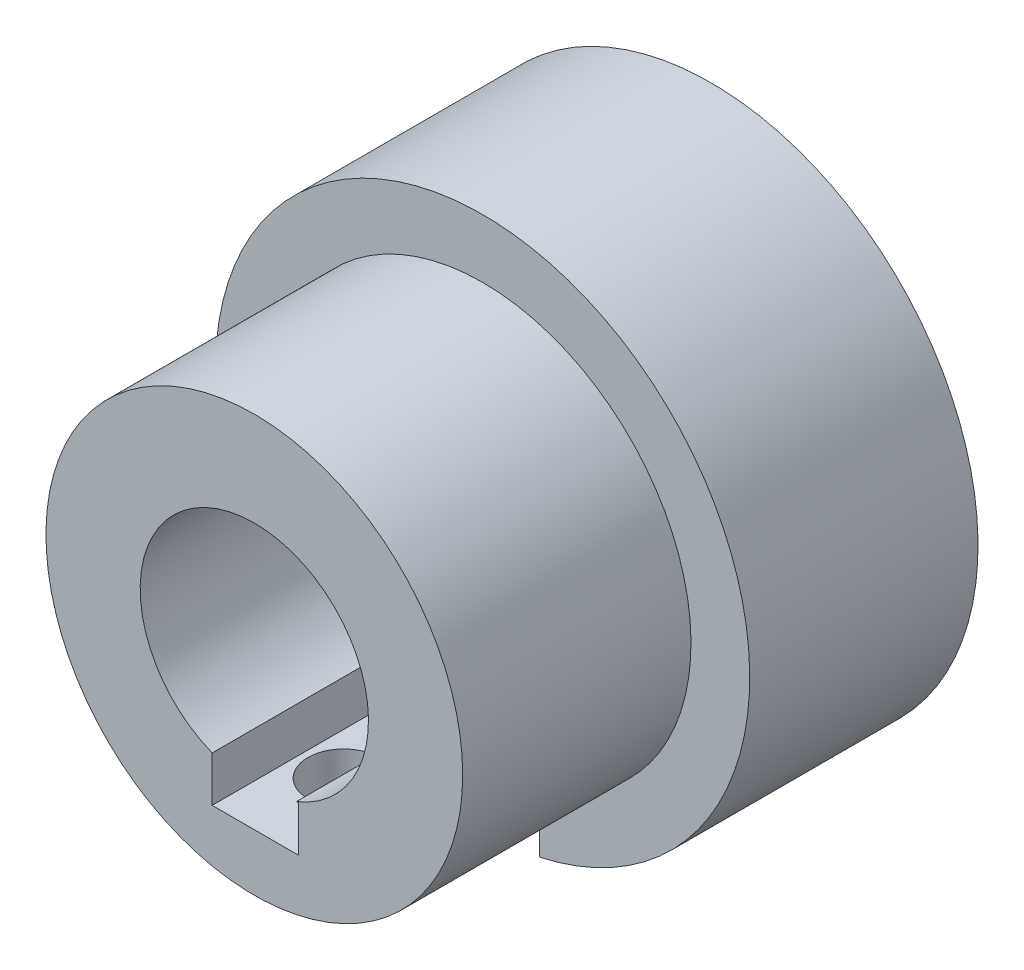
ISO-10303-21;
HEADER;
FILE_DESCRIPTION(('STEP AP214'),'2;1');
FILE_NAME('part.step','',(''),(''),'','','');
FILE_SCHEMA(('AUTOMOTIVE_DESIGN { 1 0 10303 214 1 1 1 1 }'));
ENDSEC;
DATA;
#1=APPLICATION_CONTEXT('core data for automotive mechanical design processes');
#2=APPLICATION_PROTOCOL_DEFINITION('international standard','automotive_design',2000,#1);
#3=PRODUCT_CONTEXT('',#1,'mechanical');
#4=PRODUCT('Part','Part','',(#3));
#5=PRODUCT_RELATED_PRODUCT_CATEGORY('part','',(#4));
#6=PRODUCT_DEFINITION_FORMATION('','',#4);
#7=PRODUCT_DEFINITION_CONTEXT('part definition',#1,'design');
#8=PRODUCT_DEFINITION('design','',#6,#7);
#9=PRODUCT_DEFINITION_SHAPE('','',#8);
#10=(LENGTH_UNIT() NAMED_UNIT(*) SI_UNIT(.MILLI.,.METRE.));
#11=(NAMED_UNIT(*) PLANE_ANGLE_UNIT() SI_UNIT($,.RADIAN.));
#12=(NAMED_UNIT(*) SI_UNIT($,.STERADIAN.) SOLID_ANGLE_UNIT());
#13=UNCERTAINTY_MEASURE_WITH_UNIT(LENGTH_MEASURE(1.E-05),#10,'distance_accuracy_value','');
#14=(GEOMETRIC_REPRESENTATION_CONTEXT(3) GLOBAL_UNCERTAINTY_ASSIGNED_CONTEXT((#13)) GLOBAL_UNIT_ASSIGNED_CONTEXT((#10,
#11,#12)) REPRESENTATION_CONTEXT('',''));
#15=CARTESIAN_POINT('',(0.,0.,0.));
#16=DIRECTION('',(0.,0.,1.));
#17=DIRECTION('',(1.,0.,0.));
#18=AXIS2_PLACEMENT_3D('',#15,#16,#17);
#19=CARTESIAN_POINT('',(5.,0.,20.));
#20=DIRECTION('',(1.,0.,0.));
#21=DIRECTION('',(0.,1.,0.));
#22=AXIS2_PLACEMENT_3D('',#19,#20,#21);
#23=PLANE('',#22);
#24=DIRECTION('',(0.,-1.,0.));
#25=VECTOR('',#24,1.);
#26=CARTESIAN_POINT('',(5.,0.,0.));
#27=LINE('',#26,#25);
#28=CARTESIAN_POINT('',(5.,-3.5142103749595,0.));
#29=VERTEX_POINT('',#28);
#30=CARTESIAN_POINT('',(5.,-22.8595712995673,0.));
#31=VERTEX_POINT('',#30);
#32=EDGE_CURVE('E170',#29,#31,#27,.T.);
#33=ORIENTED_EDGE('',*,*,#32,.T.);
#34=DIRECTION('',(0.,0.,-1.));
#35=VECTOR('',#34,1.);
#36=CARTESIAN_POINT('',(5.,-22.8595712995673,20.));
#37=LINE('',#36,#35);
#38=CARTESIAN_POINT('',(5.,-22.8595712995673,20.));
#39=VERTEX_POINT('',#38);
#40=EDGE_CURVE('E42',#39,#31,#37,.T.);
#41=ORIENTED_EDGE('',*,*,#40,.F.);
#42=DIRECTION('',(0.,-1.,0.));
#43=VECTOR('',#42,1.);
#44=CARTESIAN_POINT('',(5.,0.,20.));
#45=LINE('',#44,#43);
#46=CARTESIAN_POINT('',(5.,-17.5553082315678,20.));
#47=VERTEX_POINT('',#46);
#48=EDGE_CURVE('E177',#47,#39,#45,.T.);
#49=ORIENTED_EDGE('',*,*,#48,.F.);
#50=CARTESIAN_POINT('',(5.,-8.66025403784439,20.));
#51=VERTEX_POINT('',#50);
#52=EDGE_CURVE('E176',#51,#47,#45,.T.);
#53=ORIENTED_EDGE('',*,*,#52,.F.);
#54=CARTESIAN_POINT('',(5.,-3.5142103749595,20.));
#55=VERTEX_POINT('',#54);
#56=EDGE_CURVE('E173',#55,#51,#45,.T.);
#57=ORIENTED_EDGE('',*,*,#56,.F.);
#58=DIRECTION('',(0.,0.,-1.));
#59=VECTOR('',#58,1.);
#60=CARTESIAN_POINT('',(5.,-3.5142103749595,20.));
#61=LINE('',#60,#59);
#62=EDGE_CURVE('E187',#55,#29,#61,.T.);
#63=ORIENTED_EDGE('',*,*,#62,.T.);
#64=EDGE_LOOP('',(#33,#41,#49,#53,#57,#63));
#65=FACE_BOUND('',#64,.T.);
#66=ADVANCED_FACE('F34',(#65),#23,.F.);
#67=CARTESIAN_POINT('',(0.,0.,20.));
#68=DIRECTION('',(0.,0.,-1.));
#69=DIRECTION('',(-1.,0.,0.));
#70=AXIS2_PLACEMENT_3D('',#67,#68,#69);
#71=CYLINDRICAL_SURFACE('',#70,23.4);
#72=CARTESIAN_POINT('',(0.,0.,0.));
#73=DIRECTION('',(0.,0.,1.));
#74=DIRECTION('',(1.,0.,0.));
#75=AXIS2_PLACEMENT_3D('',#72,#73,#74);
#76=CIRCLE('',#75,23.4);
#77=CARTESIAN_POINT('',(-5.,-22.8595712995673,0.));
#78=VERTEX_POINT('',#77);
#79=EDGE_CURVE('E190',#31,#78,#76,.T.);
#80=ORIENTED_EDGE('',*,*,#79,.T.);
#81=DIRECTION('',(0.,0.,-1.));
#82=VECTOR('',#81,1.);
#83=CARTESIAN_POINT('',(-5.,-22.8595712995673,20.));
#84=LINE('',#83,#82);
#85=CARTESIAN_POINT('',(-5.,-22.8595712995673,20.));
#86=VERTEX_POINT('',#85);
#87=EDGE_CURVE('E202',#86,#78,#84,.T.);
#88=ORIENTED_EDGE('',*,*,#87,.F.);
#89=CARTESIAN_POINT('',(0.,0.,20.));
#90=DIRECTION('',(0.,0.,1.));
#91=DIRECTION('',(1.,0.,0.));
#92=AXIS2_PLACEMENT_3D('',#89,#90,#91);
#93=CIRCLE('',#92,23.4);
#94=EDGE_CURVE('E175',#39,#86,#93,.T.);
#95=ORIENTED_EDGE('',*,*,#94,.F.);
#96=ORIENTED_EDGE('',*,*,#40,.T.);
#97=EDGE_LOOP('',(#80,#88,#95,#96));
#98=FACE_BOUND('',#97,.T.);
#99=ADVANCED_FACE('F207',(#98),#71,.T.);
#100=CARTESIAN_POINT('',(-5.,0.,20.));
#101=DIRECTION('',(1.,0.,0.));
#102=DIRECTION('',(0.,1.,0.));
#103=AXIS2_PLACEMENT_3D('',#100,#101,#102);
#104=PLANE('',#103);
#105=DIRECTION('',(0.,-1.,0.));
#106=VECTOR('',#105,1.);
#107=CARTESIAN_POINT('',(-5.,0.,0.));
#108=LINE('',#107,#106);
#109=CARTESIAN_POINT('',(-5.,-3.5142103749595,0.));
#110=VERTEX_POINT('',#109);
#111=EDGE_CURVE('E193',#110,#78,#108,.T.);
#112=ORIENTED_EDGE('',*,*,#111,.F.);
#113=DIRECTION('',(0.,0.,-1.));
#114=VECTOR('',#113,1.);
#115=CARTESIAN_POINT('',(-5.,-3.5142103749595,20.));
#116=LINE('',#115,#114);
#117=CARTESIAN_POINT('',(-5.,-3.5142103749595,20.));
#118=VERTEX_POINT('',#117);
#119=EDGE_CURVE('E200',#118,#110,#116,.T.);
#120=ORIENTED_EDGE('',*,*,#119,.F.);
#121=DIRECTION('',(0.,-1.,0.));
#122=VECTOR('',#121,1.);
#123=CARTESIAN_POINT('',(-5.,0.,20.));
#124=LINE('',#123,#122);
#125=CARTESIAN_POINT('',(-5.,-8.66025403784439,20.));
#126=VERTEX_POINT('',#125);
#127=EDGE_CURVE('E181',#118,#126,#124,.T.);
#128=ORIENTED_EDGE('',*,*,#127,.T.);
#129=CARTESIAN_POINT('',(-5.,-17.5553082315678,20.));
#130=VERTEX_POINT('',#129);
#131=EDGE_CURVE('E185',#126,#130,#124,.T.);
#132=ORIENTED_EDGE('',*,*,#131,.T.);
#133=EDGE_CURVE('E180',#130,#86,#124,.T.);
#134=ORIENTED_EDGE('',*,*,#133,.T.);
#135=ORIENTED_EDGE('',*,*,#87,.T.);
#136=EDGE_LOOP('',(#112,#120,#128,#132,#134,#135));
#137=FACE_BOUND('',#136,.T.);
#138=ADVANCED_FACE('F220',(#137),#104,.T.);
#139=CARTESIAN_POINT('',(0.,-3.5142103749595,20.));
#140=DIRECTION('',(0.,1.,0.));
#141=DIRECTION('',(0.,0.,1.));
#142=AXIS2_PLACEMENT_3D('',#139,#140,#141);
#143=PLANE('',#142);
#144=DIRECTION('',(1.,0.,0.));
#145=VECTOR('',#144,1.);
#146=CARTESIAN_POINT('',(0.,-3.5142103749595,0.));
#147=LINE('',#146,#145);
#148=EDGE_CURVE('E196',#110,#29,#147,.T.);
#149=ORIENTED_EDGE('',*,*,#148,.T.);
#150=ORIENTED_EDGE('',*,*,#62,.F.);
#151=DIRECTION('',(1.,0.,0.));
#152=VECTOR('',#151,1.);
#153=CARTESIAN_POINT('',(0.,-3.5142103749595,20.));
#154=LINE('',#153,#152);
#155=EDGE_CURVE('E184',#118,#55,#154,.T.);
#156=ORIENTED_EDGE('',*,*,#155,.F.);
#157=ORIENTED_EDGE('',*,*,#119,.T.);
#158=EDGE_LOOP('',(#149,#150,#156,#157));
#159=FACE_BOUND('',#158,.T.);
#160=ADVANCED_FACE('F231',(#159),#143,.F.);
#161=CARTESIAN_POINT('',(0.,0.,20.));
#162=DIRECTION('',(0.,0.,1.));
#163=DIRECTION('',(1.,0.,0.));
#164=AXIS2_PLACEMENT_3D('',#161,#162,#163);
#165=PLANE('',#164);
#166=CARTESIAN_POINT('',(0.,0.,20.));
#167=DIRECTION('',(0.,0.,1.));
#168=DIRECTION('',(1.,0.,0.));
#169=AXIS2_PLACEMENT_3D('',#166,#167,#168);
#170=CIRCLE('',#169,18.2534612363068);
#171=EDGE_CURVE('E11',#47,#130,#170,.T.);
#172=ORIENTED_EDGE('',*,*,#171,.F.);
#173=ORIENTED_EDGE('',*,*,#48,.T.);
#174=ORIENTED_EDGE('',*,*,#94,.T.);
#175=ORIENTED_EDGE('',*,*,#133,.F.);
#176=EDGE_LOOP('',(#172,#173,#174,#175));
#177=FACE_BOUND('',#176,.T.);
#178=ADVANCED_FACE('F226',(#177),#165,.T.);
#179=CARTESIAN_POINT('',(0.,0.,0.));
#180=DIRECTION('',(0.,0.,1.));
#181=DIRECTION('',(1.,0.,0.));
#182=AXIS2_PLACEMENT_3D('',#179,#180,#181);
#183=PLANE('',#182);
#184=ORIENTED_EDGE('',*,*,#32,.F.);
#185=ORIENTED_EDGE('',*,*,#148,.F.);
#186=ORIENTED_EDGE('',*,*,#111,.T.);
#187=ORIENTED_EDGE('',*,*,#79,.F.);
#188=EDGE_LOOP('',(#184,#185,#186,#187));
#189=FACE_BOUND('',#188,.T.);
#190=ADVANCED_FACE('F216',(#189),#183,.F.);
#191=CARTESIAN_POINT('',(0.,0.,20.));
#192=DIRECTION('',(0.,0.,1.));
#193=DIRECTION('',(1.,0.,0.));
#194=AXIS2_PLACEMENT_3D('',#191,#192,#193);
#195=PLANE('',#194);
#196=DIRECTION('',(1.,0.,0.));
#197=VECTOR('',#196,1.);
#198=CARTESIAN_POINT('',(-3.69267479301974,-9.29323156243277,20.));
#199=LINE('',#198,#197);
#200=CARTESIAN_POINT('',(3.69267479301974,-9.29323156243277,20.));
#201=VERTEX_POINT('',#200);
#202=CARTESIAN_POINT('',(3.85530457523119,-9.29323156243277,20.));
#203=VERTEX_POINT('',#202);
#204=EDGE_CURVE('E124',#201,#203,#199,.T.);
#205=ORIENTED_EDGE('',*,*,#204,.F.);
#206=CARTESIAN_POINT('',(0.,0.,20.));
#207=DIRECTION('',(0.,0.,1.));
#208=DIRECTION('',(1.,0.,0.));
#209=AXIS2_PLACEMENT_3D('',#206,#207,#208);
#210=CIRCLE('',#209,10.);
#211=EDGE_CURVE('E129',#201,#51,#210,.T.);
#212=ORIENTED_EDGE('',*,*,#211,.T.);
#213=ORIENTED_EDGE('',*,*,#52,.T.);
#214=EDGE_CURVE('E44',#130,#47,#170,.T.);
#215=ORIENTED_EDGE('',*,*,#214,.F.);
#216=ORIENTED_EDGE('',*,*,#131,.F.);
#217=CARTESIAN_POINT('',(-3.69267479301974,-9.29323156243277,20.));
#218=VERTEX_POINT('',#217);
#219=EDGE_CURVE('E139',#126,#218,#210,.T.);
#220=ORIENTED_EDGE('',*,*,#219,.T.);
#221=DIRECTION('',(0.,-1.,0.));
#222=VECTOR('',#221,1.);
#223=CARTESIAN_POINT('',(-3.69267479301974,-9.29323156243277,20.));
#224=LINE('',#223,#222);
#225=CARTESIAN_POINT('',(-3.69267479301974,-13.2718326249172,20.));
#226=VERTEX_POINT('',#225);
#227=EDGE_CURVE('E152',#218,#226,#224,.T.);
#228=ORIENTED_EDGE('',*,*,#227,.T.);
#229=DIRECTION('',(1.,0.,0.));
#230=VECTOR('',#229,1.);
#231=CARTESIAN_POINT('',(-3.69267479301974,-13.2718326249172,20.));
#232=LINE('',#231,#230);
#233=CARTESIAN_POINT('',(3.85530457523119,-13.2718326249172,20.));
#234=VERTEX_POINT('',#233);
#235=EDGE_CURVE('E51',#226,#234,#232,.T.);
#236=ORIENTED_EDGE('',*,*,#235,.T.);
#237=DIRECTION('',(0.,-1.,0.));
#238=VECTOR('',#237,1.);
#239=CARTESIAN_POINT('',(3.85530457523119,-9.29323156243277,20.));
#240=LINE('',#239,#238);
#241=EDGE_CURVE('E142',#203,#234,#240,.T.);
#242=ORIENTED_EDGE('',*,*,#241,.F.);
#243=EDGE_LOOP('',(#205,#212,#213,#215,#216,#220,#228,#236,#242));
#244=FACE_BOUND('',#243,.T.);
#245=ADVANCED_FACE('F141',(#244),#195,.F.);
#246=CARTESIAN_POINT('',(0.,0.,40.));
#247=DIRECTION('',(0.,0.,-1.));
#248=DIRECTION('',(-1.,0.,0.));
#249=AXIS2_PLACEMENT_3D('',#246,#247,#248);
#250=CYLINDRICAL_SURFACE('',#249,18.2534612363068);
#251=CARTESIAN_POINT('',(0.,-18.2534612363068,35.3035984857365));
#252=CARTESIAN_POINT('',(0.174475005211976,-18.2534581996144,35.3035915579022));
#253=CARTESIAN_POINT('',(0.349043355417982,-18.2509336607758,35.2889633858439));
#254=CARTESIAN_POINT('',(0.693278809728229,-18.2411059240775,35.2308644850892));
#255=CARTESIAN_POINT('',(0.86294134467335,-18.2337984122419,35.1873677180271));
#256=CARTESIAN_POINT('',(1.19233542553445,-18.215223876749,35.0728878502476));
#257=CARTESIAN_POINT('',(1.35207515477382,-18.2039601681833,35.0019277573421));
#258=CARTESIAN_POINT('',(1.65736211913914,-18.1787098233045,34.8345969384169));
#259=CARTESIAN_POINT('',(1.80291086877823,-18.1647234780395,34.738228928098));
#260=CARTESIAN_POINT('',(2.07717325642452,-18.1354189138813,34.5217830534872));
#261=CARTESIAN_POINT('',(2.20572279920516,-18.1200897972084,34.4014987146657));
#262=CARTESIAN_POINT('',(2.44091977697818,-18.0899102195922,34.1410789930227));
#263=CARTESIAN_POINT('',(2.54756578881247,-18.0750597898039,34.0009423213163));
#264=CARTESIAN_POINT('',(2.73659162472485,-18.0474134045705,33.7036613821858));
#265=CARTESIAN_POINT('',(2.81880813776884,-18.0346315248359,33.5464118501306));
#266=CARTESIAN_POINT('',(2.95559656284923,-18.0127212048046,33.2200780217879));
#267=CARTESIAN_POINT('',(3.01017045560325,-18.0035925027511,33.050994574442));
#268=CARTESIAN_POINT('',(3.08960530170969,-17.9901308940269,32.7075358009288));
#269=CARTESIAN_POINT('',(3.11475021463848,-17.9857521853897,32.5332279781574));
#270=CARTESIAN_POINT('',(3.1354939674279,-17.9821478947321,32.1828165441616));
#271=CARTESIAN_POINT('',(3.13109502146235,-17.9829219265378,32.0067130685007));
#272=CARTESIAN_POINT('',(3.09310698820494,-17.9894938683675,31.659742970527));
#273=CARTESIAN_POINT('',(3.05983774969423,-17.9952367275965,31.4888401345798));
#274=CARTESIAN_POINT('',(2.9655558667857,-18.0110130110022,31.155078465691));
#275=CARTESIAN_POINT('',(2.90454221987057,-18.0210465902191,30.9922199236578));
#276=CARTESIAN_POINT('',(2.75618175954616,-18.0443328241462,30.6782170974764));
#277=CARTESIAN_POINT('',(2.66870294643424,-18.0576015487971,30.5271364214927));
#278=CARTESIAN_POINT('',(2.46998899144863,-18.0858519885008,30.2416772605553));
#279=CARTESIAN_POINT('',(2.35875182194337,-18.1008338497087,30.1073002027035));
#280=CARTESIAN_POINT('',(2.11394011688858,-18.1310639325561,29.8572120612364));
#281=CARTESIAN_POINT('',(1.98009134013972,-18.1463130678399,29.7417693749807));
#282=CARTESIAN_POINT('',(1.69478119726425,-18.1751778193107,29.5349404651006));
#283=CARTESIAN_POINT('',(1.54331970490909,-18.1887934237889,29.4435544139031));
#284=CARTESIAN_POINT('',(1.22682507969907,-18.2128780523711,29.2874051309611));
#285=CARTESIAN_POINT('',(1.06177955313346,-18.2233441615074,29.222666542115));
#286=CARTESIAN_POINT('',(0.722938286366805,-18.2399273684123,29.1219038823415));
#287=CARTESIAN_POINT('',(0.549143323318198,-18.2460448517124,29.0858772658939));
#288=CARTESIAN_POINT('',(0.20004897353141,-18.2531894436071,29.0439272198661));
#289=CARTESIAN_POINT('',(0.0247950747270641,-18.25427882591,29.0376354961145));
#290=CARTESIAN_POINT('',(-0.324262168553593,-18.2514153584402,29.0543506094048));
#291=CARTESIAN_POINT('',(-0.498065571959218,-18.2474627145238,29.0773562502918));
#292=CARTESIAN_POINT('',(-0.83814379002535,-18.2349979191946,29.1517067337829));
#293=CARTESIAN_POINT('',(-1.0044598384779,-18.226515258288,29.2028683454528));
#294=CARTESIAN_POINT('',(-1.32615407595009,-18.2059376815262,29.331882494648));
#295=CARTESIAN_POINT('',(-1.48153162039934,-18.19384255302,29.409736603491));
#296=CARTESIAN_POINT('',(-1.77853181006733,-18.1672269758631,29.5907629396757));
#297=CARTESIAN_POINT('',(-1.92001294241171,-18.1526849975265,29.6941641123198));
#298=CARTESIAN_POINT('',(-2.18374688913812,-18.1228514379648,29.9230356121394));
#299=CARTESIAN_POINT('',(-2.30599821778885,-18.1075597989392,30.0485076429664));
#300=CARTESIAN_POINT('',(-2.52917514922255,-18.0777478435703,30.319614537562));
#301=CARTESIAN_POINT('',(-2.62985134031592,-18.0632378637391,30.465456036677));
#302=CARTESIAN_POINT('',(-2.80527570048209,-18.0368283758192,30.772197301266));
#303=CARTESIAN_POINT('',(-2.880024725782,-18.024928781529,30.9330965692446));
#304=CARTESIAN_POINT('',(-3.00110415554376,-18.0051657416117,31.2647029569272));
#305=CARTESIAN_POINT('',(-3.04755651326585,-17.9972849997813,31.43536447008));
#306=CARTESIAN_POINT('',(-3.11110620023926,-17.9864093920087,31.7822150134168));
#307=CARTESIAN_POINT('',(-3.12820624744498,-17.9834140736891,31.9584035302746));
#308=CARTESIAN_POINT('',(-3.13248670576936,-17.9826687305102,32.3088145666028));
#309=CARTESIAN_POINT('',(-3.12005986976194,-17.9848498506233,32.483032265741));
#310=CARTESIAN_POINT('',(-3.06649093236457,-17.9940603282361,32.8268581644039));
#311=CARTESIAN_POINT('',(-3.02534894020798,-18.001089667293,32.9964663814609));
#312=CARTESIAN_POINT('',(-2.91567148479431,-18.0191777498439,33.3260936385562));
#313=CARTESIAN_POINT('',(-2.84717178518304,-18.0302312310744,33.4861248853637));
#314=CARTESIAN_POINT('',(-2.68476423835027,-18.0551269116536,33.792487190064));
#315=CARTESIAN_POINT('',(-2.59085500983048,-18.0689692625988,33.938817502572));
#316=CARTESIAN_POINT('',(-2.37890045672641,-18.0981002897884,34.2156047800943));
#317=CARTESIAN_POINT('',(-2.260566853784,-18.1134049453479,34.3458393424391));
#318=CARTESIAN_POINT('',(-2.00372921971255,-18.143610477921,34.5847366923054));
#319=CARTESIAN_POINT('',(-1.86522054717763,-18.158511261083,34.6933945023239));
#320=CARTESIAN_POINT('',(-1.57075068974133,-18.186357578459,34.886788635529));
#321=CARTESIAN_POINT('',(-1.41466859570891,-18.1992879202887,34.9713430742014));
#322=CARTESIAN_POINT('',(-1.09035439265417,-18.2215886269101,35.1129004167593));
#323=CARTESIAN_POINT('',(-0.92213442086108,-18.2309624908492,35.1699304165031));
#324=CARTESIAN_POINT('',(-0.62774540187155,-18.243078097505,35.2426176214917));
#325=CARTESIAN_POINT('',(-0.503344798961052,-18.2469507041652,35.2654482854889));
#326=CARTESIAN_POINT('',(-0.252645756941963,-18.252143348993,35.295941082851));
#327=CARTESIAN_POINT('',(-0.126347353707488,-18.2534634353498,35.3036035025785));
#328=CARTESIAN_POINT('',(0.,-18.2534612363068,35.3035984857365));
#329=B_SPLINE_CURVE_WITH_KNOTS('',3,(#251,#252,#253,#254,#255,#256,#257,#258,#259,#260,#261,
#262,#263,#264,#265,#266,#267,#268,#269,#270,#271,#272,#273,#274,#275,#276,#277,#278,#279,#280,
#281,#282,#283,#284,#285,#286,#287,#288,#289,#290,#291,#292,#293,#294,#295,#296,#297,#298,#299,
#300,#301,#302,#303,#304,#305,#306,#307,#308,#309,#310,#311,#312,#313,#314,#315,#316,#317,#318,
#319,#320,#321,#322,#323,#324,#325,#326,#327,#328),.UNSPECIFIED.,.T.,.F.,(4,2,2,2,2,2,2,2,2,2,2,
2,2,2,2,2,2,2,2,2,2,2,2,2,2,2,2,2,2,2,2,2,2,2,2,2,2,2,4),(0.,0.522963130697972,1.04639859627962,
1.56939649189368,2.09233851002602,2.6200082286517,3.14771222120457,3.67886840028218,
4.20998651425294,4.735936490371,5.26184704944192,5.78200446747771,6.30218068239124,
6.8249953821678,7.34785471884896,7.87758265982741,8.40731439754598,8.93753492306793,
9.46770843554592,9.99129773887514,10.51486566575,11.0350659775555,11.5552969174556,
12.0803708087603,12.6054852483697,13.1363767404147,13.6672506984578,14.1958201972875,
14.7243407491932,15.2458706035043,15.7673984739103,16.2882467915723,16.8091234289834,
17.3365409258266,17.8640799506955,18.395500348541,18.9263965281849,19.305111261805,
19.6838188455646),.UNSPECIFIED.);
#330=CARTESIAN_POINT('',(0.,-18.2534612363068,35.3035984857365));
#331=VERTEX_POINT('',#330);
#332=EDGE_CURVE('E158',#331,#331,#329,.T.);
#333=ORIENTED_EDGE('',*,*,#332,.T.);
#334=EDGE_LOOP('',(#333));
#335=FACE_BOUND('',#334,.T.);
#336=CARTESIAN_POINT('',(0.,0.,40.));
#337=DIRECTION('',(0.,0.,1.));
#338=DIRECTION('',(1.,0.,0.));
#339=AXIS2_PLACEMENT_3D('',#336,#337,#338);
#340=CIRCLE('',#339,18.2534612363068);
#341=CARTESIAN_POINT('',(18.2534612363068,0.,40.));
#342=VERTEX_POINT('',#341);
#343=EDGE_CURVE('E168',#342,#342,#340,.T.);
#344=ORIENTED_EDGE('',*,*,#343,.F.);
#345=EDGE_LOOP('',(#344));
#346=FACE_BOUND('',#345,.T.);
#347=ORIENTED_EDGE('',*,*,#214,.T.);
#348=ORIENTED_EDGE('',*,*,#171,.T.);
#349=EDGE_LOOP('',(#347,#348));
#350=FACE_BOUND('',#349,.T.);
#351=ADVANCED_FACE('F269',(#335,#346,#350),#250,.T.);
#352=CARTESIAN_POINT('',(0.,0.,40.));
#353=DIRECTION('',(0.,0.,1.));
#354=DIRECTION('',(1.,0.,0.));
#355=AXIS2_PLACEMENT_3D('',#352,#353,#354);
#356=PLANE('',#355);
#357=CARTESIAN_POINT('',(0.,0.,40.));
#358=DIRECTION('',(0.,0.,1.));
#359=DIRECTION('',(1.,0.,0.));
#360=AXIS2_PLACEMENT_3D('',#357,#358,#359);
#361=CIRCLE('',#360,10.);
#362=CARTESIAN_POINT('',(3.69267479301974,-9.29323156243277,40.));
#363=VERTEX_POINT('',#362);
#364=CARTESIAN_POINT('',(-3.69267479301974,-9.29323156243277,40.));
#365=VERTEX_POINT('',#364);
#366=EDGE_CURVE('E59',#363,#365,#361,.T.);
#367=ORIENTED_EDGE('',*,*,#366,.F.);
#368=DIRECTION('',(1.,0.,0.));
#369=VECTOR('',#368,1.);
#370=CARTESIAN_POINT('',(-3.69267479301974,-9.29323156243277,40.));
#371=LINE('',#370,#369);
#372=CARTESIAN_POINT('',(3.85530457523119,-9.29323156243277,40.));
#373=VERTEX_POINT('',#372);
#374=EDGE_CURVE('E127',#363,#373,#371,.T.);
#375=ORIENTED_EDGE('',*,*,#374,.T.);
#376=DIRECTION('',(0.,-1.,0.));
#377=VECTOR('',#376,1.);
#378=CARTESIAN_POINT('',(3.85530457523119,-9.29323156243277,40.));
#379=LINE('',#378,#377);
#380=CARTESIAN_POINT('',(3.85530457523119,-13.2718326249172,40.));
#381=VERTEX_POINT('',#380);
#382=EDGE_CURVE('E157',#373,#381,#379,.T.);
#383=ORIENTED_EDGE('',*,*,#382,.T.);
#384=DIRECTION('',(1.,0.,0.));
#385=VECTOR('',#384,1.);
#386=CARTESIAN_POINT('',(-3.69267479301974,-13.2718326249172,40.));
#387=LINE('',#386,#385);
#388=CARTESIAN_POINT('',(-3.69267479301974,-13.2718326249172,40.));
#389=VERTEX_POINT('',#388);
#390=EDGE_CURVE('E147',#389,#381,#387,.T.);
#391=ORIENTED_EDGE('',*,*,#390,.F.);
#392=DIRECTION('',(0.,-1.,0.));
#393=VECTOR('',#392,1.);
#394=CARTESIAN_POINT('',(-3.69267479301974,-9.29323156243277,40.));
#395=LINE('',#394,#393);
#396=EDGE_CURVE('E143',#365,#389,#395,.T.);
#397=ORIENTED_EDGE('',*,*,#396,.F.);
#398=EDGE_LOOP('',(#367,#375,#383,#391,#397));
#399=FACE_BOUND('',#398,.T.);
#400=ORIENTED_EDGE('',*,*,#343,.T.);
#401=EDGE_LOOP('',(#400));
#402=FACE_BOUND('',#401,.T.);
#403=ADVANCED_FACE('F278',(#399,#402),#356,.T.);
#404=CARTESIAN_POINT('',(0.,0.,20.));
#405=DIRECTION('',(0.,0.,1.));
#406=DIRECTION('',(1.,0.,0.));
#407=AXIS2_PLACEMENT_3D('',#404,#405,#406);
#408=PLANE('',#407);
#409=ORIENTED_EDGE('',*,*,#56,.T.);
#410=EDGE_CURVE('E135',#51,#126,#210,.T.);
#411=ORIENTED_EDGE('',*,*,#410,.T.);
#412=ORIENTED_EDGE('',*,*,#127,.F.);
#413=ORIENTED_EDGE('',*,*,#155,.T.);
#414=EDGE_LOOP('',(#409,#411,#412,#413));
#415=FACE_BOUND('',#414,.T.);
#416=ADVANCED_FACE('F229',(#415),#408,.T.);
#417=CARTESIAN_POINT('',(0.,0.,20.));
#418=DIRECTION('',(0.,0.,1.));
#419=DIRECTION('',(1.,0.,0.));
#420=AXIS2_PLACEMENT_3D('',#417,#418,#419);
#421=CYLINDRICAL_SURFACE('',#420,10.);
#422=ORIENTED_EDGE('',*,*,#366,.T.);
#423=DIRECTION('',(0.,0.,1.));
#424=VECTOR('',#423,1.);
#425=CARTESIAN_POINT('',(-3.69267479301974,-9.29323156243277,20.));
#426=LINE('',#425,#424);
#427=EDGE_CURVE('E128',#218,#365,#426,.T.);
#428=ORIENTED_EDGE('',*,*,#427,.F.);
#429=ORIENTED_EDGE('',*,*,#219,.F.);
#430=ORIENTED_EDGE('',*,*,#410,.F.);
#431=ORIENTED_EDGE('',*,*,#211,.F.);
#432=DIRECTION('',(0.,0.,1.));
#433=VECTOR('',#432,1.);
#434=CARTESIAN_POINT('',(3.69267479301974,-9.29323156243277,20.));
#435=LINE('',#434,#433);
#436=EDGE_CURVE('E119',#201,#363,#435,.T.);
#437=ORIENTED_EDGE('',*,*,#436,.T.);
#438=EDGE_LOOP('',(#422,#428,#429,#430,#431,#437));
#439=FACE_BOUND('',#438,.T.);
#440=ADVANCED_FACE('F133',(#439),#421,.F.);
#441=CARTESIAN_POINT('',(-3.69267479301974,-9.29323156243277,20.));
#442=DIRECTION('',(0.,-1.,0.));
#443=DIRECTION('',(0.,0.,-1.));
#444=AXIS2_PLACEMENT_3D('',#441,#442,#443);
#445=PLANE('',#444);
#446=ORIENTED_EDGE('',*,*,#436,.F.);
#447=ORIENTED_EDGE('',*,*,#204,.T.);
#448=DIRECTION('',(0.,0.,1.));
#449=VECTOR('',#448,1.);
#450=CARTESIAN_POINT('',(3.85530457523119,-9.29323156243277,20.));
#451=LINE('',#450,#449);
#452=EDGE_CURVE('E166',#203,#373,#451,.T.);
#453=ORIENTED_EDGE('',*,*,#452,.T.);
#454=ORIENTED_EDGE('',*,*,#374,.F.);
#455=EDGE_LOOP('',(#446,#447,#453,#454));
#456=FACE_BOUND('',#455,.T.);
#457=ADVANCED_FACE('F121',(#456),#445,.T.);
#458=CARTESIAN_POINT('',(3.85530457523119,-9.29323156243277,20.));
#459=DIRECTION('',(-1.,0.,0.));
#460=DIRECTION('',(0.,-1.,0.));
#461=AXIS2_PLACEMENT_3D('',#458,#459,#460);
#462=PLANE('',#461);
#463=ORIENTED_EDGE('',*,*,#382,.F.);
#464=ORIENTED_EDGE('',*,*,#452,.F.);
#465=ORIENTED_EDGE('',*,*,#241,.T.);
#466=DIRECTION('',(0.,0.,1.));
#467=VECTOR('',#466,1.);
#468=CARTESIAN_POINT('',(3.85530457523119,-13.2718326249172,20.));
#469=LINE('',#468,#467);
#470=EDGE_CURVE('E164',#234,#381,#469,.T.);
#471=ORIENTED_EDGE('',*,*,#470,.T.);
#472=EDGE_LOOP('',(#463,#464,#465,#471));
#473=FACE_BOUND('',#472,.T.);
#474=ADVANCED_FACE('F308',(#473),#462,.T.);
#475=CARTESIAN_POINT('',(-3.69267479301974,-13.2718326249172,20.));
#476=DIRECTION('',(0.,-1.,0.));
#477=DIRECTION('',(0.,0.,-1.));
#478=AXIS2_PLACEMENT_3D('',#475,#476,#477);
#479=PLANE('',#478);
#480=CARTESIAN_POINT('',(0.,-13.2718326249172,32.1730043383831));
#481=DIRECTION('',(0.,-1.,0.));
#482=DIRECTION('',(0.,0.,-1.));
#483=AXIS2_PLACEMENT_3D('',#480,#481,#482);
#484=CIRCLE('',#483,3.1305941473534);
#485=CARTESIAN_POINT('',(0.,-13.2718326249172,29.0424101910297));
#486=VERTEX_POINT('',#485);
#487=EDGE_CURVE('E37',#486,#486,#484,.T.);
#488=ORIENTED_EDGE('',*,*,#487,.T.);
#489=EDGE_LOOP('',(#488));
#490=FACE_BOUND('',#489,.T.);
#491=ORIENTED_EDGE('',*,*,#390,.T.);
#492=ORIENTED_EDGE('',*,*,#470,.F.);
#493=ORIENTED_EDGE('',*,*,#235,.F.);
#494=DIRECTION('',(0.,0.,1.));
#495=VECTOR('',#494,1.);
#496=CARTESIAN_POINT('',(-3.69267479301974,-13.2718326249172,20.));
#497=LINE('',#496,#495);
#498=EDGE_CURVE('E155',#226,#389,#497,.T.);
#499=ORIENTED_EDGE('',*,*,#498,.T.);
#500=EDGE_LOOP('',(#491,#492,#493,#499));
#501=FACE_BOUND('',#500,.T.);
#502=ADVANCED_FACE('F317',(#490,#501),#479,.F.);
#503=CARTESIAN_POINT('',(-3.69267479301974,-9.29323156243277,20.));
#504=DIRECTION('',(-1.,0.,0.));
#505=DIRECTION('',(0.,-1.,0.));
#506=AXIS2_PLACEMENT_3D('',#503,#504,#505);
#507=PLANE('',#506);
#508=ORIENTED_EDGE('',*,*,#396,.T.);
#509=ORIENTED_EDGE('',*,*,#498,.F.);
#510=ORIENTED_EDGE('',*,*,#227,.F.);
#511=ORIENTED_EDGE('',*,*,#427,.T.);
#512=EDGE_LOOP('',(#508,#509,#510,#511));
#513=FACE_BOUND('',#512,.T.);
#514=ADVANCED_FACE('F325',(#513),#507,.F.);
#515=CARTESIAN_POINT('',(0.,-20.,32.1730043383831));
#516=DIRECTION('',(0.,1.,0.));
#517=DIRECTION('',(0.,0.,1.));
#518=AXIS2_PLACEMENT_3D('',#515,#516,#517);
#519=CYLINDRICAL_SURFACE('',#518,3.1305941473534);
#520=ORIENTED_EDGE('',*,*,#487,.F.);
#521=EDGE_LOOP('',(#520));
#522=FACE_BOUND('',#521,.T.);
#523=ORIENTED_EDGE('',*,*,#332,.F.);
#524=EDGE_LOOP('',(#523));
#525=FACE_BOUND('',#524,.T.);
#526=ADVANCED_FACE('F330',(#522,#525),#519,.F.);
#527=CLOSED_SHELL('',(#66,#99,#138,#160,#178,#190,#245,#351,#403,#416,#440,#457,#474,#502,#514,#526));
#528=MANIFOLD_SOLID_BREP('B2',#527);
#529=ADVANCED_BREP_SHAPE_REPRESENTATION('',(#18,#528),#14);
#530=SHAPE_DEFINITION_REPRESENTATION(#9,#529);
ENDSEC;
END-ISO-10303-21;
